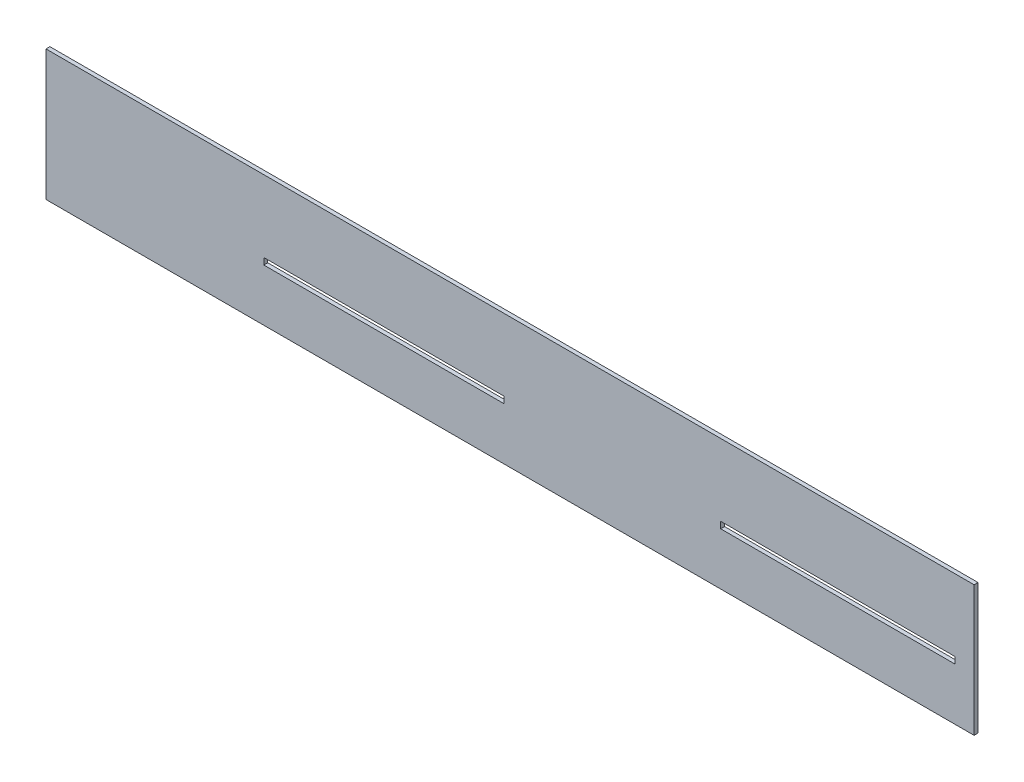
ISO-10303-21;
HEADER;
FILE_DESCRIPTION(('STEP AP214'),'2;1');
FILE_NAME('part.step','',(''),(''),'','','');
FILE_SCHEMA(('AUTOMOTIVE_DESIGN { 1 0 10303 214 1 1 1 1 }'));
ENDSEC;
DATA;
#1=APPLICATION_CONTEXT('core data for automotive mechanical design processes');
#2=APPLICATION_PROTOCOL_DEFINITION('international standard','automotive_design',2000,#1);
#3=PRODUCT_CONTEXT('',#1,'mechanical');
#4=PRODUCT('Part','Part','',(#3));
#5=PRODUCT_RELATED_PRODUCT_CATEGORY('part','',(#4));
#6=PRODUCT_DEFINITION_FORMATION('','',#4);
#7=PRODUCT_DEFINITION_CONTEXT('part definition',#1,'design');
#8=PRODUCT_DEFINITION('design','',#6,#7);
#9=PRODUCT_DEFINITION_SHAPE('','',#8);
#10=(LENGTH_UNIT() NAMED_UNIT(*) SI_UNIT(.MILLI.,.METRE.));
#11=(NAMED_UNIT(*) PLANE_ANGLE_UNIT() SI_UNIT($,.RADIAN.));
#12=(NAMED_UNIT(*) SI_UNIT($,.STERADIAN.) SOLID_ANGLE_UNIT());
#13=UNCERTAINTY_MEASURE_WITH_UNIT(LENGTH_MEASURE(1.E-05),#10,'distance_accuracy_value','');
#14=(GEOMETRIC_REPRESENTATION_CONTEXT(3) GLOBAL_UNCERTAINTY_ASSIGNED_CONTEXT((#13)) GLOBAL_UNIT_ASSIGNED_CONTEXT((#10,
#11,#12)) REPRESENTATION_CONTEXT('',''));
#15=CARTESIAN_POINT('',(0.,0.,0.));
#16=DIRECTION('',(0.,0.,1.));
#17=DIRECTION('',(1.,0.,0.));
#18=AXIS2_PLACEMENT_3D('',#15,#16,#17);
#19=CARTESIAN_POINT('',(-131.069689898686,50.,43.5));
#20=DIRECTION('',(0.,-1.,0.));
#21=DIRECTION('',(1.,0.,0.));
#22=AXIS2_PLACEMENT_3D('',#19,#20,#21);
#23=PLANE('',#22);
#24=DIRECTION('',(1.,0.,0.));
#25=VECTOR('',#24,1.);
#26=CARTESIAN_POINT('',(-87.569689898686,50.,45.));
#27=LINE('',#26,#25);
#28=CARTESIAN_POINT('',(-304.709069696058,50.,45.));
#29=VERTEX_POINT('',#28);
#30=CARTESIAN_POINT('',(51.069689898686,50.,45.));
#31=VERTEX_POINT('',#30);
#32=EDGE_CURVE('E201',#29,#31,#27,.T.);
#33=ORIENTED_EDGE('',*,*,#32,.T.);
#34=DIRECTION('',(0.,0.,1.));
#35=VECTOR('',#34,1.);
#36=CARTESIAN_POINT('',(51.069689898686,50.,43.5));
#37=LINE('',#36,#35);
#38=CARTESIAN_POINT('',(51.069689898686,50.,43.5));
#39=VERTEX_POINT('',#38);
#40=EDGE_CURVE('E218',#39,#31,#37,.T.);
#41=ORIENTED_EDGE('',*,*,#40,.F.);
#42=DIRECTION('',(1.,0.,0.));
#43=VECTOR('',#42,1.);
#44=CARTESIAN_POINT('',(-131.069689898686,50.,43.5));
#45=LINE('',#44,#43);
#46=CARTESIAN_POINT('',(-304.709069696058,50.,43.5));
#47=VERTEX_POINT('',#46);
#48=EDGE_CURVE('E202',#47,#39,#45,.T.);
#49=ORIENTED_EDGE('',*,*,#48,.F.);
#50=DIRECTION('',(0.,0.,1.));
#51=VECTOR('',#50,1.);
#52=CARTESIAN_POINT('',(-304.709069696058,50.,43.5));
#53=LINE('',#52,#51);
#54=EDGE_CURVE('E253',#47,#29,#53,.T.);
#55=ORIENTED_EDGE('',*,*,#54,.T.);
#56=EDGE_LOOP('',(#33,#41,#49,#55));
#57=FACE_BOUND('',#56,.T.);
#58=ADVANCED_FACE('F97',(#57),#23,.F.);
#59=CARTESIAN_POINT('',(-131.069689898686,0.,43.5));
#60=DIRECTION('',(0.,-1.,0.));
#61=DIRECTION('',(1.,0.,0.));
#62=AXIS2_PLACEMENT_3D('',#59,#60,#61);
#63=PLANE('',#62);
#64=DIRECTION('',(1.,0.,0.));
#65=VECTOR('',#64,1.);
#66=CARTESIAN_POINT('',(-87.569689898686,0.,45.));
#67=LINE('',#66,#65);
#68=CARTESIAN_POINT('',(-304.709069696058,0.,45.));
#69=VERTEX_POINT('',#68);
#70=CARTESIAN_POINT('',(51.069689898686,0.,45.));
#71=VERTEX_POINT('',#70);
#72=EDGE_CURVE('E190',#69,#71,#67,.T.);
#73=ORIENTED_EDGE('',*,*,#72,.F.);
#74=DIRECTION('',(0.,0.,1.));
#75=VECTOR('',#74,1.);
#76=CARTESIAN_POINT('',(-304.709069696058,0.,43.5));
#77=LINE('',#76,#75);
#78=CARTESIAN_POINT('',(-304.709069696058,0.,43.5));
#79=VERTEX_POINT('',#78);
#80=EDGE_CURVE('E261',#79,#69,#77,.T.);
#81=ORIENTED_EDGE('',*,*,#80,.F.);
#82=DIRECTION('',(1.,0.,0.));
#83=VECTOR('',#82,1.);
#84=CARTESIAN_POINT('',(-131.069689898686,0.,43.5));
#85=LINE('',#84,#83);
#86=CARTESIAN_POINT('',(51.069689898686,0.,43.5));
#87=VERTEX_POINT('',#86);
#88=EDGE_CURVE('E207',#79,#87,#85,.T.);
#89=ORIENTED_EDGE('',*,*,#88,.T.);
#90=DIRECTION('',(0.,0.,1.));
#91=VECTOR('',#90,1.);
#92=CARTESIAN_POINT('',(51.069689898686,0.,43.5));
#93=LINE('',#92,#91);
#94=EDGE_CURVE('E205',#87,#71,#93,.T.);
#95=ORIENTED_EDGE('',*,*,#94,.T.);
#96=EDGE_LOOP('',(#73,#81,#89,#95));
#97=FACE_BOUND('',#96,.T.);
#98=ADVANCED_FACE('F206',(#97),#63,.T.);
#99=CARTESIAN_POINT('',(-87.569689898686,0.,45.));
#100=DIRECTION('',(0.,0.,1.));
#101=DIRECTION('',(1.,0.,0.));
#102=AXIS2_PLACEMENT_3D('',#99,#100,#101);
#103=PLANE('',#102);
#104=ORIENTED_EDGE('',*,*,#72,.T.);
#105=DIRECTION('',(0.,1.,0.));
#106=VECTOR('',#105,1.);
#107=CARTESIAN_POINT('',(51.069689898686,0.,45.));
#108=LINE('',#107,#106);
#109=EDGE_CURVE('E194',#31,#71,#108,.F.);
#110=ORIENTED_EDGE('',*,*,#109,.F.);
#111=ORIENTED_EDGE('',*,*,#32,.F.);
#112=DIRECTION('',(0.,1.,0.));
#113=VECTOR('',#112,1.);
#114=CARTESIAN_POINT('',(-304.709069696058,0.,45.));
#115=LINE('',#114,#113);
#116=EDGE_CURVE('E196',#69,#29,#115,.T.);
#117=ORIENTED_EDGE('',*,*,#116,.F.);
#118=EDGE_LOOP('',(#104,#110,#111,#117));
#119=FACE_BOUND('',#118,.T.);
#120=DIRECTION('',(-1.,0.,0.));
#121=VECTOR('',#120,1.);
#122=CARTESIAN_POINT('',(-131.229534848029,20.,45.));
#123=LINE('',#122,#121);
#124=CARTESIAN_POINT('',(-221.209069696058,20.,45.));
#125=VERTEX_POINT('',#124);
#126=CARTESIAN_POINT('',(-129.069689898686,20.,45.));
#127=VERTEX_POINT('',#126);
#128=EDGE_CURVE('E268',#125,#127,#123,.F.);
#129=ORIENTED_EDGE('',*,*,#128,.F.);
#130=DIRECTION('',(0.,-1.,0.));
#131=VECTOR('',#130,1.);
#132=CARTESIAN_POINT('',(-221.209069696058,22.5,45.));
#133=LINE('',#132,#131);
#134=CARTESIAN_POINT('',(-221.209069696058,22.5,45.));
#135=VERTEX_POINT('',#134);
#136=EDGE_CURVE('E249',#135,#125,#133,.T.);
#137=ORIENTED_EDGE('',*,*,#136,.F.);
#138=DIRECTION('',(-1.,0.,0.));
#139=VECTOR('',#138,1.);
#140=CARTESIAN_POINT('',(-131.229534848029,22.5,45.));
#141=LINE('',#140,#139);
#142=CARTESIAN_POINT('',(-129.069689898686,22.5,45.));
#143=VERTEX_POINT('',#142);
#144=EDGE_CURVE('E236',#143,#135,#141,.T.);
#145=ORIENTED_EDGE('',*,*,#144,.F.);
#146=DIRECTION('',(0.,1.,0.));
#147=VECTOR('',#146,1.);
#148=CARTESIAN_POINT('',(-129.069689898686,20.,45.));
#149=LINE('',#148,#147);
#150=EDGE_CURVE('E123',#127,#143,#149,.T.);
#151=ORIENTED_EDGE('',*,*,#150,.F.);
#152=EDGE_LOOP('',(#129,#137,#145,#151));
#153=FACE_BOUND('',#152,.T.);
#154=DIRECTION('',(0.,-1.,0.));
#155=VECTOR('',#154,1.);
#156=CARTESIAN_POINT('',(43.75,22.5,45.));
#157=LINE('',#156,#155);
#158=CARTESIAN_POINT('',(43.75,22.5,45.));
#159=VERTEX_POINT('',#158);
#160=CARTESIAN_POINT('',(43.75,20.,45.));
#161=VERTEX_POINT('',#160);
#162=EDGE_CURVE('E12',#159,#161,#157,.T.);
#163=ORIENTED_EDGE('',*,*,#162,.T.);
#164=DIRECTION('',(-1.,0.,0.));
#165=VECTOR('',#164,1.);
#166=CARTESIAN_POINT('',(-43.909844949343,20.,45.));
#167=LINE('',#166,#165);
#168=CARTESIAN_POINT('',(-46.069689898686,20.,45.));
#169=VERTEX_POINT('',#168);
#170=EDGE_CURVE('E101',#169,#161,#167,.F.);
#171=ORIENTED_EDGE('',*,*,#170,.F.);
#172=DIRECTION('',(0.,1.,0.));
#173=VECTOR('',#172,1.);
#174=CARTESIAN_POINT('',(-46.069689898686,20.,45.));
#175=LINE('',#174,#173);
#176=CARTESIAN_POINT('',(-46.069689898686,22.5,45.));
#177=VERTEX_POINT('',#176);
#178=EDGE_CURVE('E277',#169,#177,#175,.T.);
#179=ORIENTED_EDGE('',*,*,#178,.T.);
#180=DIRECTION('',(-1.,0.,0.));
#181=VECTOR('',#180,1.);
#182=CARTESIAN_POINT('',(-43.909844949343,22.5,45.));
#183=LINE('',#182,#181);
#184=EDGE_CURVE('E115',#159,#177,#183,.T.);
#185=ORIENTED_EDGE('',*,*,#184,.F.);
#186=EDGE_LOOP('',(#163,#171,#179,#185));
#187=FACE_BOUND('',#186,.T.);
#188=ADVANCED_FACE('F192',(#119,#153,#187),#103,.T.);
#189=CARTESIAN_POINT('',(0.,0.,43.5));
#190=DIRECTION('',(0.,0.,1.));
#191=DIRECTION('',(1.,0.,0.));
#192=AXIS2_PLACEMENT_3D('',#189,#190,#191);
#193=PLANE('',#192);
#194=DIRECTION('',(0.,-1.,0.));
#195=VECTOR('',#194,1.);
#196=CARTESIAN_POINT('',(51.069689898686,50.,43.5));
#197=LINE('',#196,#195);
#198=EDGE_CURVE('E213',#39,#87,#197,.T.);
#199=ORIENTED_EDGE('',*,*,#198,.T.);
#200=ORIENTED_EDGE('',*,*,#88,.F.);
#201=DIRECTION('',(0.,1.,0.));
#202=VECTOR('',#201,1.);
#203=CARTESIAN_POINT('',(-304.709069696058,0.,43.5));
#204=LINE('',#203,#202);
#205=EDGE_CURVE('E241',#79,#47,#204,.T.);
#206=ORIENTED_EDGE('',*,*,#205,.T.);
#207=ORIENTED_EDGE('',*,*,#48,.T.);
#208=EDGE_LOOP('',(#199,#200,#206,#207));
#209=FACE_BOUND('',#208,.T.);
#210=DIRECTION('',(0.,1.,0.));
#211=VECTOR('',#210,1.);
#212=CARTESIAN_POINT('',(-221.209069696058,0.,43.5));
#213=LINE('',#212,#211);
#214=CARTESIAN_POINT('',(-221.209069696058,22.5,43.5));
#215=VERTEX_POINT('',#214);
#216=CARTESIAN_POINT('',(-221.209069696058,20.,43.5));
#217=VERTEX_POINT('',#216);
#218=EDGE_CURVE('E237',#215,#217,#213,.F.);
#219=ORIENTED_EDGE('',*,*,#218,.T.);
#220=DIRECTION('',(-1.,0.,0.));
#221=VECTOR('',#220,1.);
#222=CARTESIAN_POINT('',(-131.229534848029,20.,43.5));
#223=LINE('',#222,#221);
#224=CARTESIAN_POINT('',(-129.069689898686,20.,43.5));
#225=VERTEX_POINT('',#224);
#226=EDGE_CURVE('E269',#217,#225,#223,.F.);
#227=ORIENTED_EDGE('',*,*,#226,.T.);
#228=DIRECTION('',(0.,1.,0.));
#229=VECTOR('',#228,1.);
#230=CARTESIAN_POINT('',(-129.069689898686,0.,43.5));
#231=LINE('',#230,#229);
#232=CARTESIAN_POINT('',(-129.069689898686,22.5,43.5));
#233=VERTEX_POINT('',#232);
#234=EDGE_CURVE('E278',#225,#233,#231,.T.);
#235=ORIENTED_EDGE('',*,*,#234,.T.);
#236=DIRECTION('',(-1.,0.,0.));
#237=VECTOR('',#236,1.);
#238=CARTESIAN_POINT('',(-131.229534848029,22.5,43.5));
#239=LINE('',#238,#237);
#240=EDGE_CURVE('E265',#233,#215,#239,.T.);
#241=ORIENTED_EDGE('',*,*,#240,.T.);
#242=EDGE_LOOP('',(#219,#227,#235,#241));
#243=FACE_BOUND('',#242,.T.);
#244=DIRECTION('',(-1.,0.,0.));
#245=VECTOR('',#244,1.);
#246=CARTESIAN_POINT('',(-43.909844949343,20.,43.5));
#247=LINE('',#246,#245);
#248=CARTESIAN_POINT('',(-46.069689898686,20.,43.5));
#249=VERTEX_POINT('',#248);
#250=CARTESIAN_POINT('',(43.75,20.,43.5));
#251=VERTEX_POINT('',#250);
#252=EDGE_CURVE('E323',#249,#251,#247,.F.);
#253=ORIENTED_EDGE('',*,*,#252,.T.);
#254=DIRECTION('',(0.,-1.,0.));
#255=VECTOR('',#254,1.);
#256=CARTESIAN_POINT('',(43.75,10.,43.5));
#257=LINE('',#256,#255);
#258=CARTESIAN_POINT('',(43.75,22.5,43.5));
#259=VERTEX_POINT('',#258);
#260=EDGE_CURVE('E107',#259,#251,#257,.T.);
#261=ORIENTED_EDGE('',*,*,#260,.F.);
#262=DIRECTION('',(-1.,0.,0.));
#263=VECTOR('',#262,1.);
#264=CARTESIAN_POINT('',(-43.909844949343,22.5,43.5));
#265=LINE('',#264,#263);
#266=CARTESIAN_POINT('',(-46.069689898686,22.5,43.5));
#267=VERTEX_POINT('',#266);
#268=EDGE_CURVE('E264',#259,#267,#265,.T.);
#269=ORIENTED_EDGE('',*,*,#268,.T.);
#270=DIRECTION('',(0.,1.,0.));
#271=VECTOR('',#270,1.);
#272=CARTESIAN_POINT('',(-46.069689898686,10.,43.5));
#273=LINE('',#272,#271);
#274=EDGE_CURVE('E273',#249,#267,#273,.T.);
#275=ORIENTED_EDGE('',*,*,#274,.F.);
#276=EDGE_LOOP('',(#253,#261,#269,#275));
#277=FACE_BOUND('',#276,.T.);
#278=ADVANCED_FACE('F99',(#209,#243,#277),#193,.F.);
#279=CARTESIAN_POINT('',(-129.069689898686,20.,45.));
#280=DIRECTION('',(1.,0.,0.));
#281=DIRECTION('',(0.,1.,0.));
#282=AXIS2_PLACEMENT_3D('',#279,#280,#281);
#283=PLANE('',#282);
#284=DIRECTION('',(0.,0.,-1.));
#285=VECTOR('',#284,1.);
#286=CARTESIAN_POINT('',(-129.069689898686,20.,45.));
#287=LINE('',#286,#285);
#288=EDGE_CURVE('E292',#127,#225,#287,.T.);
#289=ORIENTED_EDGE('',*,*,#288,.F.);
#290=ORIENTED_EDGE('',*,*,#150,.T.);
#291=DIRECTION('',(0.,0.,-1.));
#292=VECTOR('',#291,1.);
#293=CARTESIAN_POINT('',(-129.069689898686,22.5,45.));
#294=LINE('',#293,#292);
#295=EDGE_CURVE('E300',#143,#233,#294,.T.);
#296=ORIENTED_EDGE('',*,*,#295,.T.);
#297=ORIENTED_EDGE('',*,*,#234,.F.);
#298=EDGE_LOOP('',(#289,#290,#296,#297));
#299=FACE_BOUND('',#298,.T.);
#300=ADVANCED_FACE('F370',(#299),#283,.F.);
#301=CARTESIAN_POINT('',(-46.069689898686,20.,45.));
#302=DIRECTION('',(-1.,0.,0.));
#303=DIRECTION('',(0.,1.,0.));
#304=AXIS2_PLACEMENT_3D('',#301,#302,#303);
#305=PLANE('',#304);
#306=DIRECTION('',(0.,0.,1.));
#307=VECTOR('',#306,1.);
#308=CARTESIAN_POINT('',(-46.069689898686,20.,45.));
#309=LINE('',#308,#307);
#310=EDGE_CURVE('E308',#249,#169,#309,.T.);
#311=ORIENTED_EDGE('',*,*,#310,.F.);
#312=ORIENTED_EDGE('',*,*,#274,.T.);
#313=DIRECTION('',(0.,0.,1.));
#314=VECTOR('',#313,1.);
#315=CARTESIAN_POINT('',(-46.069689898686,22.5,45.));
#316=LINE('',#315,#314);
#317=EDGE_CURVE('E304',#267,#177,#316,.T.);
#318=ORIENTED_EDGE('',*,*,#317,.T.);
#319=ORIENTED_EDGE('',*,*,#178,.F.);
#320=EDGE_LOOP('',(#311,#312,#318,#319));
#321=FACE_BOUND('',#320,.T.);
#322=ADVANCED_FACE('F335',(#321),#305,.F.);
#323=CARTESIAN_POINT('',(-131.229534848029,20.,44.25));
#324=DIRECTION('',(0.,-1.,0.));
#325=DIRECTION('',(-1.,0.,0.));
#326=AXIS2_PLACEMENT_3D('',#323,#324,#325);
#327=PLANE('',#326);
#328=ORIENTED_EDGE('',*,*,#128,.T.);
#329=ORIENTED_EDGE('',*,*,#288,.T.);
#330=ORIENTED_EDGE('',*,*,#226,.F.);
#331=DIRECTION('',(0.,0.,-1.));
#332=VECTOR('',#331,1.);
#333=CARTESIAN_POINT('',(-221.209069696058,20.,45.));
#334=LINE('',#333,#332);
#335=EDGE_CURVE('E245',#125,#217,#334,.T.);
#336=ORIENTED_EDGE('',*,*,#335,.F.);
#337=EDGE_LOOP('',(#328,#329,#330,#336));
#338=FACE_BOUND('',#337,.T.);
#339=ADVANCED_FACE('F376',(#338),#327,.F.);
#340=CARTESIAN_POINT('',(-131.229534848029,22.5,44.25));
#341=DIRECTION('',(0.,-1.,0.));
#342=DIRECTION('',(-1.,0.,0.));
#343=AXIS2_PLACEMENT_3D('',#340,#341,#342);
#344=PLANE('',#343);
#345=ORIENTED_EDGE('',*,*,#295,.F.);
#346=ORIENTED_EDGE('',*,*,#144,.T.);
#347=DIRECTION('',(0.,0.,-1.));
#348=VECTOR('',#347,1.);
#349=CARTESIAN_POINT('',(-221.209069696058,22.5,45.));
#350=LINE('',#349,#348);
#351=EDGE_CURVE('E232',#135,#215,#350,.T.);
#352=ORIENTED_EDGE('',*,*,#351,.T.);
#353=ORIENTED_EDGE('',*,*,#240,.F.);
#354=EDGE_LOOP('',(#345,#346,#352,#353));
#355=FACE_BOUND('',#354,.T.);
#356=ADVANCED_FACE('F379',(#355),#344,.T.);
#357=CARTESIAN_POINT('',(-304.709069696058,0.,43.5));
#358=DIRECTION('',(1.,0.,0.));
#359=DIRECTION('',(0.,1.,0.));
#360=AXIS2_PLACEMENT_3D('',#357,#358,#359);
#361=PLANE('',#360);
#362=ORIENTED_EDGE('',*,*,#54,.F.);
#363=ORIENTED_EDGE('',*,*,#205,.F.);
#364=ORIENTED_EDGE('',*,*,#80,.T.);
#365=ORIENTED_EDGE('',*,*,#116,.T.);
#366=EDGE_LOOP('',(#362,#363,#364,#365));
#367=FACE_BOUND('',#366,.T.);
#368=ADVANCED_FACE('F356',(#367),#361,.F.);
#369=CARTESIAN_POINT('',(-221.209069696058,22.5,45.));
#370=DIRECTION('',(-1.,0.,0.));
#371=DIRECTION('',(0.,-1.,0.));
#372=AXIS2_PLACEMENT_3D('',#369,#370,#371);
#373=PLANE('',#372);
#374=ORIENTED_EDGE('',*,*,#351,.F.);
#375=ORIENTED_EDGE('',*,*,#136,.T.);
#376=ORIENTED_EDGE('',*,*,#335,.T.);
#377=ORIENTED_EDGE('',*,*,#218,.F.);
#378=EDGE_LOOP('',(#374,#375,#376,#377));
#379=FACE_BOUND('',#378,.T.);
#380=ADVANCED_FACE('F348',(#379),#373,.F.);
#381=CARTESIAN_POINT('',(-43.909844949343,22.5,44.25));
#382=DIRECTION('',(0.,-1.,0.));
#383=DIRECTION('',(-1.,0.,0.));
#384=AXIS2_PLACEMENT_3D('',#381,#382,#383);
#385=PLANE('',#384);
#386=ORIENTED_EDGE('',*,*,#268,.F.);
#387=DIRECTION('',(0.,0.,-1.));
#388=VECTOR('',#387,1.);
#389=CARTESIAN_POINT('',(43.75,22.5,45.));
#390=LINE('',#389,#388);
#391=EDGE_CURVE('E226',#259,#159,#390,.F.);
#392=ORIENTED_EDGE('',*,*,#391,.T.);
#393=ORIENTED_EDGE('',*,*,#184,.T.);
#394=ORIENTED_EDGE('',*,*,#317,.F.);
#395=EDGE_LOOP('',(#386,#392,#393,#394));
#396=FACE_BOUND('',#395,.T.);
#397=ADVANCED_FACE('F346',(#396),#385,.T.);
#398=CARTESIAN_POINT('',(-43.909844949343,20.,44.25));
#399=DIRECTION('',(0.,-1.,0.));
#400=DIRECTION('',(-1.,0.,0.));
#401=AXIS2_PLACEMENT_3D('',#398,#399,#400);
#402=PLANE('',#401);
#403=ORIENTED_EDGE('',*,*,#170,.T.);
#404=DIRECTION('',(0.,0.,-1.));
#405=VECTOR('',#404,1.);
#406=CARTESIAN_POINT('',(43.75,20.,45.));
#407=LINE('',#406,#405);
#408=EDGE_CURVE('E212',#251,#161,#407,.F.);
#409=ORIENTED_EDGE('',*,*,#408,.F.);
#410=ORIENTED_EDGE('',*,*,#252,.F.);
#411=ORIENTED_EDGE('',*,*,#310,.T.);
#412=EDGE_LOOP('',(#403,#409,#410,#411));
#413=FACE_BOUND('',#412,.T.);
#414=ADVANCED_FACE('F339',(#413),#402,.F.);
#415=CARTESIAN_POINT('',(43.75,22.5,45.));
#416=DIRECTION('',(1.,0.,0.));
#417=DIRECTION('',(0.,-1.,0.));
#418=AXIS2_PLACEMENT_3D('',#415,#416,#417);
#419=PLANE('',#418);
#420=ORIENTED_EDGE('',*,*,#391,.F.);
#421=ORIENTED_EDGE('',*,*,#260,.T.);
#422=ORIENTED_EDGE('',*,*,#408,.T.);
#423=ORIENTED_EDGE('',*,*,#162,.F.);
#424=EDGE_LOOP('',(#420,#421,#422,#423));
#425=FACE_BOUND('',#424,.T.);
#426=ADVANCED_FACE('F345',(#425),#419,.F.);
#427=CARTESIAN_POINT('',(51.069689898686,50.,43.5));
#428=DIRECTION('',(-1.,0.,0.));
#429=DIRECTION('',(0.,-1.,0.));
#430=AXIS2_PLACEMENT_3D('',#427,#428,#429);
#431=PLANE('',#430);
#432=ORIENTED_EDGE('',*,*,#94,.F.);
#433=ORIENTED_EDGE('',*,*,#198,.F.);
#434=ORIENTED_EDGE('',*,*,#40,.T.);
#435=ORIENTED_EDGE('',*,*,#109,.T.);
#436=EDGE_LOOP('',(#432,#433,#434,#435));
#437=FACE_BOUND('',#436,.T.);
#438=ADVANCED_FACE('F216',(#437),#431,.F.);
#439=CLOSED_SHELL('',(#58,#98,#188,#278,#300,#322,#339,#356,#368,#380,#397,#414,#426,#438));
#440=MANIFOLD_SOLID_BREP('B2',#439);
#441=ADVANCED_BREP_SHAPE_REPRESENTATION('',(#18,#440),#14);
#442=SHAPE_DEFINITION_REPRESENTATION(#9,#441);
ENDSEC;
END-ISO-10303-21;
